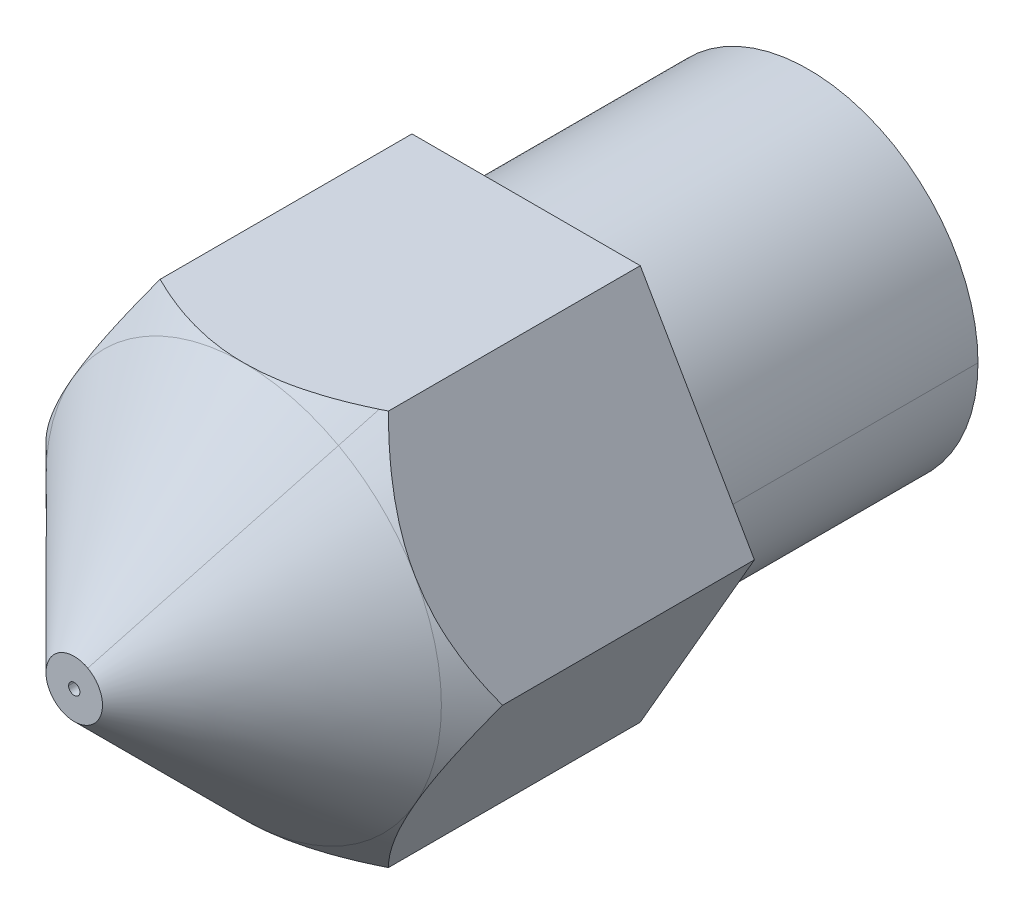
ISO-10303-21;
HEADER;
FILE_DESCRIPTION(('STEP AP214'),'2;1');
FILE_NAME('part.step','',(''),(''),'','','');
FILE_SCHEMA(('AUTOMOTIVE_DESIGN { 1 0 10303 214 1 1 1 1 }'));
ENDSEC;
DATA;
#1=APPLICATION_CONTEXT('core data for automotive mechanical design processes');
#2=APPLICATION_PROTOCOL_DEFINITION('international standard','automotive_design',2000,#1);
#3=PRODUCT_CONTEXT('',#1,'mechanical');
#4=PRODUCT('Part','Part','',(#3));
#5=PRODUCT_RELATED_PRODUCT_CATEGORY('part','',(#4));
#6=PRODUCT_DEFINITION_FORMATION('','',#4);
#7=PRODUCT_DEFINITION_CONTEXT('part definition',#1,'design');
#8=PRODUCT_DEFINITION('design','',#6,#7);
#9=PRODUCT_DEFINITION_SHAPE('','',#8);
#10=(LENGTH_UNIT() NAMED_UNIT(*) SI_UNIT(.MILLI.,.METRE.));
#11=(NAMED_UNIT(*) PLANE_ANGLE_UNIT() SI_UNIT($,.RADIAN.));
#12=(NAMED_UNIT(*) SI_UNIT($,.STERADIAN.) SOLID_ANGLE_UNIT());
#13=UNCERTAINTY_MEASURE_WITH_UNIT(LENGTH_MEASURE(1.E-05),#10,'distance_accuracy_value','');
#14=(GEOMETRIC_REPRESENTATION_CONTEXT(3) GLOBAL_UNCERTAINTY_ASSIGNED_CONTEXT((#13)) GLOBAL_UNIT_ASSIGNED_CONTEXT((#10,
#11,#12)) REPRESENTATION_CONTEXT('',''));
#15=CARTESIAN_POINT('',(0.,0.,0.));
#16=DIRECTION('',(0.,0.,1.));
#17=DIRECTION('',(1.,0.,0.));
#18=AXIS2_PLACEMENT_3D('',#15,#16,#17);
#19=CARTESIAN_POINT('',(0.,0.,-2.5));
#20=DIRECTION('',(0.,0.,-1.));
#21=DIRECTION('',(1.,0.,0.));
#22=AXIS2_PLACEMENT_3D('',#19,#20,#21);
#23=CYLINDRICAL_SURFACE('',#22,2.1);
#24=DIRECTION('',(0.,0.,1.));
#25=VECTOR('',#24,1.);
#26=CARTESIAN_POINT('',(-2.1,0.,-2.5));
#27=LINE('',#26,#25);
#28=CARTESIAN_POINT('',(-2.1,0.,-5.));
#29=VERTEX_POINT('',#28);
#30=CARTESIAN_POINT('',(-2.1,0.,0.));
#31=VERTEX_POINT('',#30);
#32=EDGE_CURVE('E11',#29,#31,#27,.T.);
#33=ORIENTED_EDGE('',*,*,#32,.F.);
#34=CARTESIAN_POINT('',(0.,0.,-5.));
#35=DIRECTION('',(0.,0.,-1.));
#36=DIRECTION('',(1.,0.,0.));
#37=AXIS2_PLACEMENT_3D('',#34,#35,#36);
#38=CIRCLE('',#37,2.1);
#39=CARTESIAN_POINT('',(2.1,0.,-5.));
#40=VERTEX_POINT('',#39);
#41=EDGE_CURVE('E299',#29,#40,#38,.T.);
#42=ORIENTED_EDGE('',*,*,#41,.T.);
#43=DIRECTION('',(0.,0.,1.));
#44=VECTOR('',#43,1.);
#45=CARTESIAN_POINT('',(2.1,0.,-2.5));
#46=LINE('',#45,#44);
#47=CARTESIAN_POINT('',(2.1,0.,0.));
#48=VERTEX_POINT('',#47);
#49=EDGE_CURVE('E29',#40,#48,#46,.T.);
#50=ORIENTED_EDGE('',*,*,#49,.T.);
#51=CARTESIAN_POINT('',(0.,0.,0.));
#52=DIRECTION('',(0.,0.,1.));
#53=DIRECTION('',(1.,0.,0.));
#54=AXIS2_PLACEMENT_3D('',#51,#52,#53);
#55=CIRCLE('',#54,2.1);
#56=EDGE_CURVE('E235',#48,#31,#55,.T.);
#57=ORIENTED_EDGE('',*,*,#56,.T.);
#58=EDGE_LOOP('',(#33,#42,#50,#57));
#59=FACE_BOUND('',#58,.T.);
#60=ADVANCED_FACE('F16',(#59),#23,.F.);
#61=CARTESIAN_POINT('',(0.,0.,-2.5));
#62=DIRECTION('',(0.,0.,-1.));
#63=DIRECTION('',(1.,0.,0.));
#64=AXIS2_PLACEMENT_3D('',#61,#62,#63);
#65=CYLINDRICAL_SURFACE('',#64,2.1);
#66=ORIENTED_EDGE('',*,*,#49,.F.);
#67=CARTESIAN_POINT('',(0.,0.,-5.));
#68=DIRECTION('',(0.,0.,-1.));
#69=DIRECTION('',(1.,0.,0.));
#70=AXIS2_PLACEMENT_3D('',#67,#68,#69);
#71=CIRCLE('',#70,2.1);
#72=EDGE_CURVE('E369',#40,#29,#71,.T.);
#73=ORIENTED_EDGE('',*,*,#72,.T.);
#74=ORIENTED_EDGE('',*,*,#32,.T.);
#75=CARTESIAN_POINT('',(0.,0.,0.));
#76=DIRECTION('',(0.,0.,1.));
#77=DIRECTION('',(1.,0.,0.));
#78=AXIS2_PLACEMENT_3D('',#75,#76,#77);
#79=CIRCLE('',#78,2.1);
#80=EDGE_CURVE('E240',#31,#48,#79,.T.);
#81=ORIENTED_EDGE('',*,*,#80,.T.);
#82=EDGE_LOOP('',(#66,#73,#74,#81));
#83=FACE_BOUND('',#82,.T.);
#84=ADVANCED_FACE('F529',(#83),#65,.F.);
#85=CARTESIAN_POINT('',(0.,0.,-5.));
#86=DIRECTION('',(0.,0.,-1.));
#87=DIRECTION('',(0.,-1.,0.));
#88=AXIS2_PLACEMENT_3D('',#85,#86,#87);
#89=PLANE('',#88);
#90=ORIENTED_EDGE('',*,*,#72,.F.);
#91=ORIENTED_EDGE('',*,*,#41,.F.);
#92=EDGE_LOOP('',(#90,#91));
#93=FACE_BOUND('',#92,.T.);
#94=CARTESIAN_POINT('',(0.,0.,-5.));
#95=DIRECTION('',(0.,0.,-1.));
#96=DIRECTION('',(1.,0.,0.));
#97=AXIS2_PLACEMENT_3D('',#94,#95,#96);
#98=CIRCLE('',#97,3.);
#99=CARTESIAN_POINT('',(3.,0.,-5.));
#100=VERTEX_POINT('',#99);
#101=CARTESIAN_POINT('',(-3.,0.,-5.));
#102=VERTEX_POINT('',#101);
#103=EDGE_CURVE('E357',#100,#102,#98,.T.);
#104=ORIENTED_EDGE('',*,*,#103,.T.);
#105=CARTESIAN_POINT('',(0.,0.,-5.));
#106=DIRECTION('',(0.,0.,-1.));
#107=DIRECTION('',(1.,0.,0.));
#108=AXIS2_PLACEMENT_3D('',#105,#106,#107);
#109=CIRCLE('',#108,3.);
#110=EDGE_CURVE('E420',#102,#100,#109,.T.);
#111=ORIENTED_EDGE('',*,*,#110,.T.);
#112=EDGE_LOOP('',(#104,#111));
#113=FACE_BOUND('',#112,.T.);
#114=ADVANCED_FACE('F597',(#93,#113),#89,.T.);
#115=CARTESIAN_POINT('',(0.,0.,1.1));
#116=DIRECTION('',(0.,0.,-1.));
#117=DIRECTION('',(-0.50000000000019,0.866025403784329,0.));
#118=AXIS2_PLACEMENT_3D('',#115,#116,#117);
#119=CONICAL_SURFACE('',#118,0.999999999999103,0.785398163397);
#120=DIRECTION('',(0.707106781186548,0.,0.707106781186548));
#121=VECTOR('',#120,1.);
#122=CARTESIAN_POINT('',(-1.1,0.,1.));
#123=LINE('',#122,#121);
#124=CARTESIAN_POINT('',(-0.1,0.,2.));
#125=VERTEX_POINT('',#124);
#126=EDGE_CURVE('E241',#31,#125,#123,.T.);
#127=ORIENTED_EDGE('',*,*,#126,.T.);
#128=CARTESIAN_POINT('',(0.,0.,2.));
#129=DIRECTION('',(0.,0.,1.));
#130=DIRECTION('',(1.,0.,0.));
#131=AXIS2_PLACEMENT_3D('',#128,#129,#130);
#132=CIRCLE('',#131,0.1);
#133=CARTESIAN_POINT('',(0.1,0.,2.));
#134=VERTEX_POINT('',#133);
#135=EDGE_CURVE('E308',#125,#134,#132,.T.);
#136=ORIENTED_EDGE('',*,*,#135,.T.);
#137=DIRECTION('',(-0.707106781186548,0.,0.707106781186548));
#138=VECTOR('',#137,1.);
#139=CARTESIAN_POINT('',(1.1,0.,1.));
#140=LINE('',#139,#138);
#141=EDGE_CURVE('E385',#48,#134,#140,.T.);
#142=ORIENTED_EDGE('',*,*,#141,.F.);
#143=ORIENTED_EDGE('',*,*,#80,.F.);
#144=EDGE_LOOP('',(#127,#136,#142,#143));
#145=FACE_BOUND('',#144,.T.);
#146=ADVANCED_FACE('F601',(#145),#119,.F.);
#147=CARTESIAN_POINT('',(0.,0.,1.1));
#148=DIRECTION('',(0.,0.,-1.));
#149=DIRECTION('',(1.,0.,0.));
#150=AXIS2_PLACEMENT_3D('',#147,#148,#149);
#151=CONICAL_SURFACE('',#150,0.999999999999103,0.785398163397);
#152=ORIENTED_EDGE('',*,*,#141,.T.);
#153=CARTESIAN_POINT('',(0.,0.,2.));
#154=DIRECTION('',(0.,0.,1.));
#155=DIRECTION('',(1.,0.,0.));
#156=AXIS2_PLACEMENT_3D('',#153,#154,#155);
#157=CIRCLE('',#156,0.1);
#158=EDGE_CURVE('E342',#134,#125,#157,.T.);
#159=ORIENTED_EDGE('',*,*,#158,.T.);
#160=ORIENTED_EDGE('',*,*,#126,.F.);
#161=ORIENTED_EDGE('',*,*,#56,.F.);
#162=EDGE_LOOP('',(#152,#159,#160,#161));
#163=FACE_BOUND('',#162,.T.);
#164=ADVANCED_FACE('F542',(#163),#151,.F.);
#165=CARTESIAN_POINT('',(0.,0.,1.));
#166=DIRECTION('',(0.,0.,1.));
#167=DIRECTION('',(1.,0.,0.));
#168=AXIS2_PLACEMENT_3D('',#165,#166,#167);
#169=CYLINDRICAL_SURFACE('',#168,0.1);
#170=ORIENTED_EDGE('',*,*,#135,.F.);
#171=DIRECTION('',(0.,0.,-1.));
#172=VECTOR('',#171,1.);
#173=CARTESIAN_POINT('',(-0.1,0.,1.));
#174=LINE('',#173,#172);
#175=CARTESIAN_POINT('',(-0.1,0.,8.));
#176=VERTEX_POINT('',#175);
#177=EDGE_CURVE('E304',#176,#125,#174,.T.);
#178=ORIENTED_EDGE('',*,*,#177,.F.);
#179=CARTESIAN_POINT('',(0.,0.,8.));
#180=DIRECTION('',(0.,0.,1.));
#181=DIRECTION('',(1.,0.,0.));
#182=AXIS2_PLACEMENT_3D('',#179,#180,#181);
#183=CIRCLE('',#182,0.1);
#184=CARTESIAN_POINT('',(0.1,0.,8.));
#185=VERTEX_POINT('',#184);
#186=EDGE_CURVE('E328',#176,#185,#183,.T.);
#187=ORIENTED_EDGE('',*,*,#186,.T.);
#188=DIRECTION('',(0.,0.,-1.));
#189=VECTOR('',#188,1.);
#190=CARTESIAN_POINT('',(0.1,0.,1.));
#191=LINE('',#190,#189);
#192=EDGE_CURVE('E309',#185,#134,#191,.T.);
#193=ORIENTED_EDGE('',*,*,#192,.T.);
#194=EDGE_LOOP('',(#170,#178,#187,#193));
#195=FACE_BOUND('',#194,.T.);
#196=ADVANCED_FACE('F538',(#195),#169,.F.);
#197=CARTESIAN_POINT('',(0.,0.,1.));
#198=DIRECTION('',(0.,0.,1.));
#199=DIRECTION('',(1.,0.,0.));
#200=AXIS2_PLACEMENT_3D('',#197,#198,#199);
#201=CYLINDRICAL_SURFACE('',#200,0.1);
#202=ORIENTED_EDGE('',*,*,#158,.F.);
#203=ORIENTED_EDGE('',*,*,#192,.F.);
#204=CARTESIAN_POINT('',(0.,0.,8.));
#205=DIRECTION('',(0.,0.,1.));
#206=DIRECTION('',(1.,0.,0.));
#207=AXIS2_PLACEMENT_3D('',#204,#205,#206);
#208=CIRCLE('',#207,0.1);
#209=EDGE_CURVE('E324',#185,#176,#208,.T.);
#210=ORIENTED_EDGE('',*,*,#209,.T.);
#211=ORIENTED_EDGE('',*,*,#177,.T.);
#212=EDGE_LOOP('',(#202,#203,#210,#211));
#213=FACE_BOUND('',#212,.T.);
#214=ADVANCED_FACE('F541',(#213),#201,.F.);
#215=CARTESIAN_POINT('',(0.,0.,8.));
#216=DIRECTION('',(0.,0.,1.));
#217=DIRECTION('',(1.,0.,0.));
#218=AXIS2_PLACEMENT_3D('',#215,#216,#217);
#219=PLANE('',#218);
#220=ORIENTED_EDGE('',*,*,#209,.F.);
#221=ORIENTED_EDGE('',*,*,#186,.F.);
#222=EDGE_LOOP('',(#220,#221));
#223=FACE_BOUND('',#222,.T.);
#224=CARTESIAN_POINT('',(0.,0.,8.));
#225=DIRECTION('',(0.,0.,-1.));
#226=DIRECTION('',(-0.479425538604204,-0.877582561890372,0.));
#227=AXIS2_PLACEMENT_3D('',#224,#225,#226);
#228=CIRCLE('',#227,0.5);
#229=CARTESIAN_POINT('',(-0.239712769302,-0.438791280945,8.));
#230=VERTEX_POINT('',#229);
#231=CARTESIAN_POINT('',(0.239712769302,0.438791280945,8.));
#232=VERTEX_POINT('',#231);
#233=EDGE_CURVE('E563',#230,#232,#228,.T.);
#234=ORIENTED_EDGE('',*,*,#233,.F.);
#235=CARTESIAN_POINT('',(0.,0.,8.));
#236=DIRECTION('',(0.,0.,-1.));
#237=DIRECTION('',(0.479425538604206,0.877582561890371,0.));
#238=AXIS2_PLACEMENT_3D('',#235,#236,#237);
#239=CIRCLE('',#238,0.5);
#240=EDGE_CURVE('E453',#232,#230,#239,.T.);
#241=ORIENTED_EDGE('',*,*,#240,.F.);
#242=EDGE_LOOP('',(#234,#241));
#243=FACE_BOUND('',#242,.T.);
#244=ADVANCED_FACE('F514',(#223,#243),#219,.T.);
#245=CARTESIAN_POINT('',(0.,0.,8.));
#246=DIRECTION('',(0.,0.,-1.));
#247=DIRECTION('',(-0.479425538604204,-0.877582561890372,0.));
#248=AXIS2_PLACEMENT_3D('',#245,#246,#247);
#249=CONICAL_SURFACE('',#248,0.5,0.785398163397);
#250=CARTESIAN_POINT('',(0.,0.,5.));
#251=DIRECTION('',(0.,0.,-1.));
#252=DIRECTION('',(1.,0.,0.));
#253=AXIS2_PLACEMENT_3D('',#250,#251,#252);
#254=CIRCLE('',#253,3.5);
#255=CARTESIAN_POINT('',(0.,-3.5,5.));
#256=VERTEX_POINT('',#255);
#257=CARTESIAN_POINT('',(-1.67798938511,-3.07153896662,5.));
#258=VERTEX_POINT('',#257);
#259=EDGE_CURVE('E253',#256,#258,#254,.T.);
#260=ORIENTED_EDGE('',*,*,#259,.T.);
#261=DIRECTION('',(0.339005049420843,0.620544580563713,0.707106781186673));
#262=VECTOR('',#261,1.);
#263=CARTESIAN_POINT('',(-2.52471911871,-4.62146734757,3.23386602212));
#264=LINE('',#263,#262);
#265=CARTESIAN_POINT('',(-1.91205871445,-3.5,4.51177125436));
#266=VERTEX_POINT('',#265);
#267=EDGE_CURVE('E197',#266,#258,#264,.T.);
#268=ORIENTED_EDGE('',*,*,#267,.F.);
#269=CARTESIAN_POINT('',(-2.99967239936E-07,-3.5,4.99999954088));
#270=CARTESIAN_POINT('',(-0.0812121167621,-3.5,4.99999954088));
#271=CARTESIAN_POINT('',(-0.162423958203,-3.5,4.99764419383));
#272=CARTESIAN_POINT('',(-0.243490094198,-3.5,4.99293348996));
#273=CARTESIAN_POINT('',(-0.491200453842,-3.5,4.9714155439));
#274=CARTESIAN_POINT('',(-0.734677478373,-3.5,4.92914020951));
#275=CARTESIAN_POINT('',(-0.895701981959,-3.5,4.89206954358));
#276=CARTESIAN_POINT('',(-1.20392005799,-3.5,4.80557013717));
#277=CARTESIAN_POINT('',(-1.49848234293,-3.5,4.69614124757));
#278=CARTESIAN_POINT('',(-1.63935466622,-3.5,4.63811623536));
#279=CARTESIAN_POINT('',(-1.77710401478,-3.5,4.57647198394));
#280=CARTESIAN_POINT('',(-1.91205871445,-3.5,4.51177125436));
#281=(BOUNDED_CURVE() B_SPLINE_CURVE(5,(#269,#270,#271,#272,#273,#274,#275,#276,#277,#278,#279,
#280),.UNSPECIFIED.,.F.,.F.) B_SPLINE_CURVE_WITH_KNOTS((6,3,3,6),(2.51104797308,2.97899187071,
3.94608377711,4.87207920238),
.UNSPECIFIED.) CURVE() GEOMETRIC_REPRESENTATION_ITEM() RATIONAL_B_SPLINE_CURVE((1.,1.,1.,1.,1.,
1.,1.,1.,1.,1.,1.,1.)) REPRESENTATION_ITEM(''));
#282=EDGE_CURVE('E247',#256,#266,#281,.T.);
#283=ORIENTED_EDGE('',*,*,#282,.F.);
#284=EDGE_LOOP('',(#260,#268,#283));
#285=FACE_BOUND('',#284,.T.);
#286=ADVANCED_FACE('F511',(#285),#249,.T.);
#287=CARTESIAN_POINT('',(0.,0.,8.));
#288=DIRECTION('',(0.,0.,-1.));
#289=DIRECTION('',(-0.479425538604204,-0.877582561890372,0.));
#290=AXIS2_PLACEMENT_3D('',#287,#288,#289);
#291=CONICAL_SURFACE('',#290,0.5,0.785398163397);
#292=ORIENTED_EDGE('',*,*,#267,.T.);
#293=CARTESIAN_POINT('',(0.,0.,5.));
#294=DIRECTION('',(0.,0.,-1.));
#295=DIRECTION('',(1.,0.,0.));
#296=AXIS2_PLACEMENT_3D('',#293,#294,#295);
#297=CIRCLE('',#296,3.5);
#298=CARTESIAN_POINT('',(-3.03108891325,-1.75,5.));
#299=VERTEX_POINT('',#298);
#300=EDGE_CURVE('E191',#258,#299,#297,.T.);
#301=ORIENTED_EDGE('',*,*,#300,.T.);
#302=CARTESIAN_POINT('',(-2.02072594216,-3.5,4.45854811567));
#303=CARTESIAN_POINT('',(-2.09810511936,-3.36597533365,4.53592729287));
#304=CARTESIAN_POINT('',(-2.17728734773,-3.22882769106,4.6095537064));
#305=CARTESIAN_POINT('',(-2.2585486808,-3.08807893349,4.67865414033));
#306=CARTESIAN_POINT('',(-2.41691717901,-2.81377664827,4.79871612158));
#307=CARTESIAN_POINT('',(-2.58323830721,-2.52570000386,4.89206956696));
#308=CARTESIAN_POINT('',(-2.6637494928,-2.38625053983,4.92913987874));
#309=CARTESIAN_POINT('',(-2.78548863582,-2.17539215886,4.97141561315));
#310=CARTESIAN_POINT('',(-2.90934398522,-1.96086840091,4.99293347988));
#311=CARTESIAN_POINT('',(-2.94987708856,-1.89066300653,4.99764418396));
#312=CARTESIAN_POINT('',(-2.99048306973,-1.82033138405,4.99999954088));
#313=CARTESIAN_POINT('',(-3.03108906323,-1.74999974022,4.99999954088));
#314=(BOUNDED_CURVE() B_SPLINE_CURVE(5,(#302,#303,#304,#305,#306,#307,#308,#309,#310,#311,#312,
#313),.UNSPECIFIED.,.F.,.F.) B_SPLINE_CURVE_WITH_KNOTS((6,3,3,6),(0.,1.07600843705,
2.04310309478,2.51104797307),
.UNSPECIFIED.) CURVE() GEOMETRIC_REPRESENTATION_ITEM() RATIONAL_B_SPLINE_CURVE((1.,1.,1.,1.,1.,
1.,1.,1.,1.,1.,1.,1.)) REPRESENTATION_ITEM(''));
#315=CARTESIAN_POINT('',(-2.02072594216,-3.5,4.45854811567));
#316=VERTEX_POINT('',#315);
#317=EDGE_CURVE('E195',#316,#299,#314,.T.);
#318=ORIENTED_EDGE('',*,*,#317,.F.);
#319=CARTESIAN_POINT('',(-1.91205871445,-3.5,4.51177125436));
#320=CARTESIAN_POINT('',(-1.93393638314,-3.5,4.50128254127));
#321=CARTESIAN_POINT('',(-1.95574060818,-3.5,4.49071350696));
#322=CARTESIAN_POINT('',(-1.97747499525,-3.5,4.48006545566));
#323=CARTESIAN_POINT('',(-1.9991355617,-3.5,4.4693433059));
#324=CARTESIAN_POINT('',(-2.02072594216,-3.5,4.45854811567));
#325=(BOUNDED_CURVE() B_SPLINE_CURVE(5,(#319,#320,#321,#322,#323,#324),.UNSPECIFIED.,.F.,
.F.) B_SPLINE_CURVE_WITH_KNOTS((6,6),(0.,0.150114232149),
.UNSPECIFIED.) CURVE() GEOMETRIC_REPRESENTATION_ITEM() RATIONAL_B_SPLINE_CURVE((1.,1.,1.,1.,1.,1.)) REPRESENTATION_ITEM(''));
#326=EDGE_CURVE('E208',#266,#316,#325,.T.);
#327=ORIENTED_EDGE('',*,*,#326,.F.);
#328=EDGE_LOOP('',(#292,#301,#318,#327));
#329=FACE_BOUND('',#328,.T.);
#330=ADVANCED_FACE('F192',(#329),#291,.T.);
#331=CARTESIAN_POINT('',(0.,0.,8.));
#332=DIRECTION('',(0.,0.,-1.));
#333=DIRECTION('',(-0.479425538604204,-0.877582561890372,0.));
#334=AXIS2_PLACEMENT_3D('',#331,#332,#333);
#335=CONICAL_SURFACE('',#334,0.5,0.785398163397);
#336=CARTESIAN_POINT('',(0.,0.,5.));
#337=DIRECTION('',(0.,0.,-1.));
#338=DIRECTION('',(1.,0.,0.));
#339=AXIS2_PLACEMENT_3D('',#336,#337,#338);
#340=CIRCLE('',#339,3.5);
#341=CARTESIAN_POINT('',(3.03108891325,-1.75,5.));
#342=VERTEX_POINT('',#341);
#343=EDGE_CURVE('E259',#342,#256,#340,.T.);
#344=ORIENTED_EDGE('',*,*,#343,.T.);
#345=CARTESIAN_POINT('',(2.02072594216,-3.5,4.45854811567));
#346=CARTESIAN_POINT('',(1.86596758778,-3.5,4.53592729287));
#347=CARTESIAN_POINT('',(1.70760313103,-3.5,4.60955370639));
#348=CARTESIAN_POINT('',(1.54508046489,-3.5,4.67865414033));
#349=CARTESIAN_POINT('',(1.22834346847,-3.5,4.79871612158));
#350=CARTESIAN_POINT('',(0.895701212072,-3.5,4.89206956696));
#351=CARTESIAN_POINT('',(0.734678840883,-3.5,4.92913987874));
#352=CARTESIAN_POINT('',(0.491200554853,-3.5,4.97141561315));
#353=CARTESIAN_POINT('',(0.243489856057,-3.5,4.99293347988));
#354=CARTESIAN_POINT('',(0.162423649366,-3.5,4.99764418396));
#355=CARTESIAN_POINT('',(0.0812116870222,-3.5,4.99999954088));
#356=CARTESIAN_POINT('',(-2.99967239936E-07,-3.5,4.99999954088));
#357=(BOUNDED_CURVE() B_SPLINE_CURVE(5,(#345,#346,#347,#348,#349,#350,#351,#352,#353,#354,#355,
#356),.UNSPECIFIED.,.F.,.F.) B_SPLINE_CURVE_WITH_KNOTS((6,3,3,6),(0.,1.07600843705,
2.04310309478,2.51104797308),
.UNSPECIFIED.) CURVE() GEOMETRIC_REPRESENTATION_ITEM() RATIONAL_B_SPLINE_CURVE((1.,1.,1.,1.,1.,
1.,1.,1.,1.,1.,1.,1.)) REPRESENTATION_ITEM(''));
#358=CARTESIAN_POINT('',(2.02072594216,-3.5,4.45854811567));
#359=VERTEX_POINT('',#358);
#360=EDGE_CURVE('E217',#359,#256,#357,.T.);
#361=ORIENTED_EDGE('',*,*,#360,.F.);
#362=CARTESIAN_POINT('',(3.03108876326,-1.75000025978,4.99999954088));
#363=CARTESIAN_POINT('',(2.99048285486,-1.82033175621,4.99999954088));
#364=CARTESIAN_POINT('',(2.94987693414,-1.89066327399,4.99764419383));
#365=CARTESIAN_POINT('',(2.90934386615,-1.96086860715,4.99293348996));
#366=CARTESIAN_POINT('',(2.78548868632,-2.17539207138,4.9714155439));
#367=CARTESIAN_POINT('',(2.66375017406,-2.38624935986,4.92914020951));
#368=CARTESIAN_POINT('',(2.58323792227,-2.52570067059,4.89206954358));
#369=CARTESIAN_POINT('',(2.41691714671,-2.81377670422,4.7987158471));
#370=CARTESIAN_POINT('',(2.25854923692,-3.08807797026,4.6786547851));
#371=CARTESIAN_POINT('',(2.17728689381,-3.22882847726,4.60955328433));
#372=CARTESIAN_POINT('',(2.09810489757,-3.3659757178,4.53592707108));
#373=CARTESIAN_POINT('',(2.02072594216,-3.5,4.45854811567));
#374=(BOUNDED_CURVE() B_SPLINE_CURVE(5,(#362,#363,#364,#365,#366,#367,#368,#369,#370,#371,#372,
#373),.UNSPECIFIED.,.F.,.F.) B_SPLINE_CURVE_WITH_KNOTS((6,3,3,6),(2.51104797306,2.97899187069,
3.94608377711,5.02208913003),
.UNSPECIFIED.) CURVE() GEOMETRIC_REPRESENTATION_ITEM() RATIONAL_B_SPLINE_CURVE((1.,1.,1.,1.,1.,
1.,1.,1.,1.,1.,1.,1.)) REPRESENTATION_ITEM(''));
#375=EDGE_CURVE('E285',#342,#359,#374,.T.);
#376=ORIENTED_EDGE('',*,*,#375,.F.);
#377=EDGE_LOOP('',(#344,#361,#376));
#378=FACE_BOUND('',#377,.T.);
#379=ADVANCED_FACE('F494',(#378),#335,.T.);
#380=CARTESIAN_POINT('',(0.,0.,8.));
#381=DIRECTION('',(0.,0.,-1.));
#382=DIRECTION('',(-0.479425538604204,-0.877582561890372,0.));
#383=AXIS2_PLACEMENT_3D('',#380,#381,#382);
#384=CONICAL_SURFACE('',#383,0.5,0.785398163397);
#385=ORIENTED_EDGE('',*,*,#259,.F.);
#386=ORIENTED_EDGE('',*,*,#343,.F.);
#387=CARTESIAN_POINT('',(0.,0.,5.));
#388=DIRECTION('',(0.,0.,-1.));
#389=DIRECTION('',(1.,0.,0.));
#390=AXIS2_PLACEMENT_3D('',#387,#388,#389);
#391=CIRCLE('',#390,3.5);
#392=CARTESIAN_POINT('',(3.03108891325,1.75,5.));
#393=VERTEX_POINT('',#392);
#394=EDGE_CURVE('E228',#393,#342,#391,.T.);
#395=ORIENTED_EDGE('',*,*,#394,.F.);
#396=CARTESIAN_POINT('',(0.,0.,5.));
#397=DIRECTION('',(0.,0.,-1.));
#398=DIRECTION('',(1.,0.,0.));
#399=AXIS2_PLACEMENT_3D('',#396,#397,#398);
#400=CIRCLE('',#399,3.5);
#401=CARTESIAN_POINT('',(1.67798938511,3.07153896662,5.));
#402=VERTEX_POINT('',#401);
#403=EDGE_CURVE('E345',#402,#393,#400,.T.);
#404=ORIENTED_EDGE('',*,*,#403,.F.);
#405=DIRECTION('',(-0.339005049420843,-0.620544580563713,0.707106781186673));
#406=VECTOR('',#405,1.);
#407=CARTESIAN_POINT('',(2.52471911871,4.62146734757,3.23386602212));
#408=LINE('',#407,#406);
#409=EDGE_CURVE('E144',#402,#232,#408,.T.);
#410=ORIENTED_EDGE('',*,*,#409,.T.);
#411=ORIENTED_EDGE('',*,*,#240,.T.);
#412=DIRECTION('',(0.339005049420843,0.620544580563713,0.707106781186673));
#413=VECTOR('',#412,1.);
#414=CARTESIAN_POINT('',(-2.52471911871,-4.62146734757,3.23386602212));
#415=LINE('',#414,#413);
#416=EDGE_CURVE('E201',#258,#230,#415,.T.);
#417=ORIENTED_EDGE('',*,*,#416,.F.);
#418=EDGE_LOOP('',(#385,#386,#395,#404,#410,#411,#417));
#419=FACE_BOUND('',#418,.T.);
#420=ADVANCED_FACE('F484',(#419),#384,.T.);
#421=CARTESIAN_POINT('',(0.,0.,8.));
#422=DIRECTION('',(0.,0.,-1.));
#423=DIRECTION('',(-0.479425538604204,-0.877582561890372,0.));
#424=AXIS2_PLACEMENT_3D('',#421,#422,#423);
#425=CONICAL_SURFACE('',#424,0.5,0.785398163397);
#426=CARTESIAN_POINT('',(0.,0.,5.));
#427=DIRECTION('',(0.,0.,-1.));
#428=DIRECTION('',(1.,0.,0.));
#429=AXIS2_PLACEMENT_3D('',#426,#427,#428);
#430=CIRCLE('',#429,3.5);
#431=CARTESIAN_POINT('',(0.,3.5,5.));
#432=VERTEX_POINT('',#431);
#433=EDGE_CURVE('E260',#432,#402,#430,.T.);
#434=ORIENTED_EDGE('',*,*,#433,.F.);
#435=CARTESIAN_POINT('',(0.,0.,5.));
#436=DIRECTION('',(0.,0.,-1.));
#437=DIRECTION('',(1.,0.,0.));
#438=AXIS2_PLACEMENT_3D('',#435,#436,#437);
#439=CIRCLE('',#438,3.5);
#440=CARTESIAN_POINT('',(-3.03108891325,1.75,5.));
#441=VERTEX_POINT('',#440);
#442=EDGE_CURVE('E205',#441,#432,#439,.T.);
#443=ORIENTED_EDGE('',*,*,#442,.F.);
#444=CARTESIAN_POINT('',(0.,0.,5.));
#445=DIRECTION('',(0.,0.,-1.));
#446=DIRECTION('',(1.,0.,0.));
#447=AXIS2_PLACEMENT_3D('',#444,#445,#446);
#448=CIRCLE('',#447,3.5);
#449=EDGE_CURVE('E131',#299,#441,#448,.T.);
#450=ORIENTED_EDGE('',*,*,#449,.F.);
#451=ORIENTED_EDGE('',*,*,#300,.F.);
#452=ORIENTED_EDGE('',*,*,#416,.T.);
#453=ORIENTED_EDGE('',*,*,#233,.T.);
#454=ORIENTED_EDGE('',*,*,#409,.F.);
#455=EDGE_LOOP('',(#434,#443,#450,#451,#452,#453,#454));
#456=FACE_BOUND('',#455,.T.);
#457=ADVANCED_FACE('F203',(#456),#425,.T.);
#458=CARTESIAN_POINT('',(0.,0.,8.));
#459=DIRECTION('',(0.,0.,-1.));
#460=DIRECTION('',(-0.479425538604204,-0.877582561890372,0.));
#461=AXIS2_PLACEMENT_3D('',#458,#459,#460);
#462=CONICAL_SURFACE('',#461,0.5,0.785398163397);
#463=ORIENTED_EDGE('',*,*,#449,.T.);
#464=CARTESIAN_POINT('',(-4.04145188433,0.,4.45854811567));
#465=CARTESIAN_POINT('',(-3.96407270713,0.134024666348,4.53592729287));
#466=CARTESIAN_POINT('',(-3.88489047876,0.271172308943,4.6095537064));
#467=CARTESIAN_POINT('',(-3.80362914569,0.411921066511,4.67865414033));
#468=CARTESIAN_POINT('',(-3.64526064748,0.686223351728,4.79871612158));
#469=CARTESIAN_POINT('',(-3.47893951928,0.974299996145,4.89206956696));
#470=CARTESIAN_POINT('',(-3.39842833369,1.11374946017,4.92913987874));
#471=CARTESIAN_POINT('',(-3.27668919067,1.32460784114,4.97141561315));
#472=CARTESIAN_POINT('',(-3.15283384128,1.53913159909,4.99293347988));
#473=CARTESIAN_POINT('',(-3.11230073793,1.60933699347,4.99764418396));
#474=CARTESIAN_POINT('',(-3.07169475676,1.67966861595,4.99999954088));
#475=CARTESIAN_POINT('',(-3.03108876326,1.75000025978,4.99999954088));
#476=(BOUNDED_CURVE() B_SPLINE_CURVE(5,(#464,#465,#466,#467,#468,#469,#470,#471,#472,#473,#474,
#475),.UNSPECIFIED.,.F.,.F.) B_SPLINE_CURVE_WITH_KNOTS((6,3,3,6),(0.,1.07600843705,
2.04310309478,2.51104797307),
.UNSPECIFIED.) CURVE() GEOMETRIC_REPRESENTATION_ITEM() RATIONAL_B_SPLINE_CURVE((1.,1.,1.,1.,1.,
1.,1.,1.,1.,1.,1.,1.)) REPRESENTATION_ITEM(''));
#477=CARTESIAN_POINT('',(-4.04145188433,0.,4.45854811567));
#478=VERTEX_POINT('',#477);
#479=EDGE_CURVE('E213',#478,#441,#476,.T.);
#480=ORIENTED_EDGE('',*,*,#479,.F.);
#481=CARTESIAN_POINT('',(-3.03108906323,-1.74999974022,4.99999954088));
#482=CARTESIAN_POINT('',(-3.07169497163,-1.67966824379,4.99999954088));
#483=CARTESIAN_POINT('',(-3.11230089235,-1.60933672601,4.99764419383));
#484=CARTESIAN_POINT('',(-3.15283396035,-1.53913139285,4.99293348996));
#485=CARTESIAN_POINT('',(-3.27668914017,-1.32460792862,4.9714155439));
#486=CARTESIAN_POINT('',(-3.39842765243,-1.11375064014,4.92914020951));
#487=CARTESIAN_POINT('',(-3.47893990423,-0.974299329402,4.89206954358));
#488=CARTESIAN_POINT('',(-3.64526067978,-0.68622329578,4.7987158471));
#489=CARTESIAN_POINT('',(-3.80362858957,-0.411922029742,4.6786547851));
#490=CARTESIAN_POINT('',(-3.88489093268,-0.27117152274,4.60955328433));
#491=CARTESIAN_POINT('',(-3.96407292892,-0.134024282197,4.53592707108));
#492=CARTESIAN_POINT('',(-4.04145188433,0.,4.45854811567));
#493=(BOUNDED_CURVE() B_SPLINE_CURVE(5,(#481,#482,#483,#484,#485,#486,#487,#488,#489,#490,#491,
#492),.UNSPECIFIED.,.F.,.F.) B_SPLINE_CURVE_WITH_KNOTS((6,3,3,6),(2.51104797307,2.97899187069,
3.94608377708,5.02208913001),
.UNSPECIFIED.) CURVE() GEOMETRIC_REPRESENTATION_ITEM() RATIONAL_B_SPLINE_CURVE((1.,1.,1.,1.,1.,
1.,1.,1.,1.,1.,1.,1.)) REPRESENTATION_ITEM(''));
#494=EDGE_CURVE('E210',#299,#478,#493,.T.);
#495=ORIENTED_EDGE('',*,*,#494,.F.);
#496=EDGE_LOOP('',(#463,#480,#495));
#497=FACE_BOUND('',#496,.T.);
#498=ADVANCED_FACE('F211',(#497),#462,.T.);
#499=CARTESIAN_POINT('',(-2.02072594216,-3.5,0.));
#500=DIRECTION('',(0.,-1.,0.));
#501=DIRECTION('',(0.,0.,-1.));
#502=AXIS2_PLACEMENT_3D('',#499,#500,#501);
#503=PLANE('',#502);
#504=DIRECTION('',(0.,0.,1.));
#505=VECTOR('',#504,1.);
#506=CARTESIAN_POINT('',(-2.02072594216,-3.5,2.22927405784));
#507=LINE('',#506,#505);
#508=CARTESIAN_POINT('',(-2.02072594216,-3.5,0.));
#509=VERTEX_POINT('',#508);
#510=EDGE_CURVE('E221',#509,#316,#507,.T.);
#511=ORIENTED_EDGE('',*,*,#510,.F.);
#512=DIRECTION('',(1.,0.,0.));
#513=VECTOR('',#512,1.);
#514=CARTESIAN_POINT('',(0.,-3.5,0.));
#515=LINE('',#514,#513);
#516=CARTESIAN_POINT('',(2.02072594216,-3.5,0.));
#517=VERTEX_POINT('',#516);
#518=EDGE_CURVE('E234',#509,#517,#515,.T.);
#519=ORIENTED_EDGE('',*,*,#518,.T.);
#520=DIRECTION('',(0.,0.,1.));
#521=VECTOR('',#520,1.);
#522=CARTESIAN_POINT('',(2.02072594216,-3.5,2.22927405784));
#523=LINE('',#522,#521);
#524=EDGE_CURVE('E286',#517,#359,#523,.T.);
#525=ORIENTED_EDGE('',*,*,#524,.T.);
#526=ORIENTED_EDGE('',*,*,#360,.T.);
#527=ORIENTED_EDGE('',*,*,#282,.T.);
#528=ORIENTED_EDGE('',*,*,#326,.T.);
#529=EDGE_LOOP('',(#511,#519,#525,#526,#527,#528));
#530=FACE_BOUND('',#529,.T.);
#531=ADVANCED_FACE('F523',(#530),#503,.T.);
#532=CARTESIAN_POINT('',(-4.04145188433,0.,0.));
#533=DIRECTION('',(-0.866025403784329,-0.50000000000019,0.));
#534=DIRECTION('',(-0.50000000000019,0.866025403784329,0.));
#535=AXIS2_PLACEMENT_3D('',#532,#533,#534);
#536=PLANE('',#535);
#537=DIRECTION('',(0.,0.,1.));
#538=VECTOR('',#537,1.);
#539=CARTESIAN_POINT('',(-4.04145188433,0.,2.22927405784));
#540=LINE('',#539,#538);
#541=CARTESIAN_POINT('',(-4.04145188433,0.,0.));
#542=VERTEX_POINT('',#541);
#543=EDGE_CURVE('E301',#542,#478,#540,.T.);
#544=ORIENTED_EDGE('',*,*,#543,.F.);
#545=DIRECTION('',(0.50000000000019,-0.866025403784329,0.));
#546=VECTOR('',#545,1.);
#547=CARTESIAN_POINT('',(-3.03108891325,-1.75,0.));
#548=LINE('',#547,#546);
#549=EDGE_CURVE('E265',#542,#509,#548,.T.);
#550=ORIENTED_EDGE('',*,*,#549,.T.);
#551=ORIENTED_EDGE('',*,*,#510,.T.);
#552=ORIENTED_EDGE('',*,*,#317,.T.);
#553=ORIENTED_EDGE('',*,*,#494,.T.);
#554=EDGE_LOOP('',(#544,#550,#551,#552,#553));
#555=FACE_BOUND('',#554,.T.);
#556=ADVANCED_FACE('F219',(#555),#536,.T.);
#557=CARTESIAN_POINT('',(0.,0.,8.));
#558=DIRECTION('',(0.,0.,-1.));
#559=DIRECTION('',(-0.479425538604204,-0.877582561890372,0.));
#560=AXIS2_PLACEMENT_3D('',#557,#558,#559);
#561=CONICAL_SURFACE('',#560,0.5,0.785398163397);
#562=ORIENTED_EDGE('',*,*,#394,.T.);
#563=CARTESIAN_POINT('',(4.04145188433,0.,4.45854811567));
#564=CARTESIAN_POINT('',(3.96407270713,-0.134024666348,4.53592729287));
#565=CARTESIAN_POINT('',(3.88489047876,-0.271172308944,4.6095537064));
#566=CARTESIAN_POINT('',(3.80362914569,-0.411921066511,4.67865414033));
#567=CARTESIAN_POINT('',(3.64526064748,-0.686223351726,4.79871612158));
#568=CARTESIAN_POINT('',(3.47893951928,-0.974299996141,4.89206956696));
#569=CARTESIAN_POINT('',(3.39842833368,-1.11374946018,4.92913987874));
#570=CARTESIAN_POINT('',(3.27668919067,-1.32460784115,4.97141561315));
#571=CARTESIAN_POINT('',(3.15283384127,-1.53913159909,4.99293347988));
#572=CARTESIAN_POINT('',(3.11230073793,-1.60933699347,4.99764418396));
#573=CARTESIAN_POINT('',(3.07169475676,-1.67966861595,4.99999954088));
#574=CARTESIAN_POINT('',(3.03108876326,-1.75000025978,4.99999954088));
#575=(BOUNDED_CURVE() B_SPLINE_CURVE(5,(#563,#564,#565,#566,#567,#568,#569,#570,#571,#572,#573,
#574),.UNSPECIFIED.,.F.,.F.) B_SPLINE_CURVE_WITH_KNOTS((6,3,3,6),(0.,1.07600843706,
2.04310309477,2.51104797306),
.UNSPECIFIED.) CURVE() GEOMETRIC_REPRESENTATION_ITEM() RATIONAL_B_SPLINE_CURVE((1.,1.,1.,1.,1.,
1.,1.,1.,1.,1.,1.,1.)) REPRESENTATION_ITEM(''));
#576=CARTESIAN_POINT('',(4.04145188433,0.,4.45854811567));
#577=VERTEX_POINT('',#576);
#578=EDGE_CURVE('E276',#577,#342,#575,.T.);
#579=ORIENTED_EDGE('',*,*,#578,.F.);
#580=CARTESIAN_POINT('',(3.03108906323,1.74999974022,4.99999954088));
#581=CARTESIAN_POINT('',(3.07169497163,1.67966824379,4.99999954088));
#582=CARTESIAN_POINT('',(3.11230089235,1.60933672601,4.99764419383));
#583=CARTESIAN_POINT('',(3.15283396035,1.53913139285,4.99293348996));
#584=CARTESIAN_POINT('',(3.27668914017,1.32460792862,4.9714155439));
#585=CARTESIAN_POINT('',(3.39842765243,1.11375064014,4.92914020951));
#586=CARTESIAN_POINT('',(3.47893990423,0.974299329403,4.89206954358));
#587=CARTESIAN_POINT('',(3.64526067978,0.686223295781,4.7987158471));
#588=CARTESIAN_POINT('',(3.80362858957,0.411922029743,4.6786547851));
#589=CARTESIAN_POINT('',(3.88489093268,0.271171522739,4.60955328433));
#590=CARTESIAN_POINT('',(3.96407292892,0.134024282197,4.53592707108));
#591=CARTESIAN_POINT('',(4.04145188433,0.,4.45854811567));
#592=(BOUNDED_CURVE() B_SPLINE_CURVE(5,(#580,#581,#582,#583,#584,#585,#586,#587,#588,#589,#590,
#591),.UNSPECIFIED.,.F.,.F.) B_SPLINE_CURVE_WITH_KNOTS((6,3,3,6),(2.51104797307,2.9789918707,
3.9460837771,5.02208913003),
.UNSPECIFIED.) CURVE() GEOMETRIC_REPRESENTATION_ITEM() RATIONAL_B_SPLINE_CURVE((1.,1.,1.,1.,1.,
1.,1.,1.,1.,1.,1.,1.)) REPRESENTATION_ITEM(''));
#593=EDGE_CURVE('E269',#393,#577,#592,.T.);
#594=ORIENTED_EDGE('',*,*,#593,.F.);
#595=EDGE_LOOP('',(#562,#579,#594));
#596=FACE_BOUND('',#595,.T.);
#597=ADVANCED_FACE('F495',(#596),#561,.T.);
#598=CARTESIAN_POINT('',(2.02072594216,-3.5,0.));
#599=DIRECTION('',(0.866025403784329,-0.50000000000019,0.));
#600=DIRECTION('',(0.,0.,-1.));
#601=AXIS2_PLACEMENT_3D('',#598,#599,#600);
#602=PLANE('',#601);
#603=ORIENTED_EDGE('',*,*,#524,.F.);
#604=DIRECTION('',(0.50000000000019,0.866025403784329,0.));
#605=VECTOR('',#604,1.);
#606=CARTESIAN_POINT('',(3.03108891325,-1.75,0.));
#607=LINE('',#606,#605);
#608=CARTESIAN_POINT('',(4.04145188433,0.,0.));
#609=VERTEX_POINT('',#608);
#610=EDGE_CURVE('E275',#517,#609,#607,.T.);
#611=ORIENTED_EDGE('',*,*,#610,.T.);
#612=DIRECTION('',(0.,0.,1.));
#613=VECTOR('',#612,1.);
#614=CARTESIAN_POINT('',(4.04145188433,0.,2.22927405784));
#615=LINE('',#614,#613);
#616=EDGE_CURVE('E246',#609,#577,#615,.T.);
#617=ORIENTED_EDGE('',*,*,#616,.T.);
#618=ORIENTED_EDGE('',*,*,#578,.T.);
#619=ORIENTED_EDGE('',*,*,#375,.T.);
#620=EDGE_LOOP('',(#603,#611,#617,#618,#619));
#621=FACE_BOUND('',#620,.T.);
#622=ADVANCED_FACE('F530',(#621),#602,.T.);
#623=CARTESIAN_POINT('',(0.,0.,8.));
#624=DIRECTION('',(0.,0.,-1.));
#625=DIRECTION('',(-0.479425538604204,-0.877582561890372,0.));
#626=AXIS2_PLACEMENT_3D('',#623,#624,#625);
#627=CONICAL_SURFACE('',#626,0.5,0.785398163397);
#628=DIRECTION('',(-0.339005049420843,-0.620544580563713,0.707106781186673));
#629=VECTOR('',#628,1.);
#630=CARTESIAN_POINT('',(2.52471911871,4.62146734757,3.23386602212));
#631=LINE('',#630,#629);
#632=CARTESIAN_POINT('',(1.91205871445,3.5,4.51177125436));
#633=VERTEX_POINT('',#632);
#634=EDGE_CURVE('E264',#633,#402,#631,.T.);
#635=ORIENTED_EDGE('',*,*,#634,.T.);
#636=ORIENTED_EDGE('',*,*,#403,.T.);
#637=CARTESIAN_POINT('',(2.02072594216,3.5,4.45854811567));
#638=CARTESIAN_POINT('',(2.09810511936,3.36597533365,4.53592729287));
#639=CARTESIAN_POINT('',(2.17728734773,3.22882769106,4.6095537064));
#640=CARTESIAN_POINT('',(2.2585486808,3.08807893349,4.67865414033));
#641=CARTESIAN_POINT('',(2.41691717901,2.81377664827,4.79871612158));
#642=CARTESIAN_POINT('',(2.58323830721,2.52570000386,4.89206956696));
#643=CARTESIAN_POINT('',(2.66374949281,2.38625053983,4.92913987874));
#644=CARTESIAN_POINT('',(2.78548863582,2.17539215886,4.97141561315));
#645=CARTESIAN_POINT('',(2.90934398522,1.96086840091,4.99293347988));
#646=CARTESIAN_POINT('',(2.94987708856,1.89066300653,4.99764418396));
#647=CARTESIAN_POINT('',(2.99048306973,1.82033138405,4.99999954088));
#648=CARTESIAN_POINT('',(3.03108906323,1.74999974022,4.99999954088));
#649=(BOUNDED_CURVE() B_SPLINE_CURVE(5,(#637,#638,#639,#640,#641,#642,#643,#644,#645,#646,#647,
#648),.UNSPECIFIED.,.F.,.F.) B_SPLINE_CURVE_WITH_KNOTS((6,3,3,6),(0.,1.07600843706,
2.04310309478,2.51104797307),
.UNSPECIFIED.) CURVE() GEOMETRIC_REPRESENTATION_ITEM() RATIONAL_B_SPLINE_CURVE((1.,1.,1.,1.,1.,
1.,1.,1.,1.,1.,1.,1.)) REPRESENTATION_ITEM(''));
#650=CARTESIAN_POINT('',(2.02072594216,3.5,4.45854811567));
#651=VERTEX_POINT('',#650);
#652=EDGE_CURVE('E245',#651,#393,#649,.T.);
#653=ORIENTED_EDGE('',*,*,#652,.F.);
#654=CARTESIAN_POINT('',(1.91205871445,3.5,4.51177125436));
#655=CARTESIAN_POINT('',(1.93393638314,3.5,4.50128254127));
#656=CARTESIAN_POINT('',(1.95574060818,3.5,4.49071350696));
#657=CARTESIAN_POINT('',(1.97747499525,3.5,4.48006545566));
#658=CARTESIAN_POINT('',(1.9991355617,3.5,4.4693433059));
#659=CARTESIAN_POINT('',(2.02072594216,3.5,4.45854811567));
#660=(BOUNDED_CURVE() B_SPLINE_CURVE(5,(#654,#655,#656,#657,#658,#659),.UNSPECIFIED.,.F.,
.F.) B_SPLINE_CURVE_WITH_KNOTS((6,6),(0.,0.150114232149),
.UNSPECIFIED.) CURVE() GEOMETRIC_REPRESENTATION_ITEM() RATIONAL_B_SPLINE_CURVE((1.,1.,1.,1.,1.,1.)) REPRESENTATION_ITEM(''));
#661=EDGE_CURVE('E329',#633,#651,#660,.T.);
#662=ORIENTED_EDGE('',*,*,#661,.F.);
#663=EDGE_LOOP('',(#635,#636,#653,#662));
#664=FACE_BOUND('',#663,.T.);
#665=ADVANCED_FACE('F533',(#664),#627,.T.);
#666=CARTESIAN_POINT('',(0.,0.,8.));
#667=DIRECTION('',(0.,0.,-1.));
#668=DIRECTION('',(-0.479425538604204,-0.877582561890372,0.));
#669=AXIS2_PLACEMENT_3D('',#666,#667,#668);
#670=CONICAL_SURFACE('',#669,0.5,0.785398163397);
#671=ORIENTED_EDGE('',*,*,#433,.T.);
#672=ORIENTED_EDGE('',*,*,#634,.F.);
#673=CARTESIAN_POINT('',(2.99967222173E-07,3.5,4.99999954088));
#674=CARTESIAN_POINT('',(0.0812121167626,3.5,4.99999954088));
#675=CARTESIAN_POINT('',(0.162423958204,3.5,4.99764419383));
#676=CARTESIAN_POINT('',(0.243490094199,3.5,4.99293348996));
#677=CARTESIAN_POINT('',(0.491200453841,3.5,4.9714155439));
#678=CARTESIAN_POINT('',(0.734677478371,3.5,4.92914020951));
#679=CARTESIAN_POINT('',(0.895701981962,3.5,4.89206954357));
#680=CARTESIAN_POINT('',(1.20392005799,3.5,4.80557013717));
#681=CARTESIAN_POINT('',(1.49848234292,3.5,4.69614124757));
#682=CARTESIAN_POINT('',(1.63935466622,3.5,4.63811623536));
#683=CARTESIAN_POINT('',(1.77710401478,3.5,4.57647198394));
#684=CARTESIAN_POINT('',(1.91205871445,3.5,4.51177125436));
#685=(BOUNDED_CURVE() B_SPLINE_CURVE(5,(#673,#674,#675,#676,#677,#678,#679,#680,#681,#682,#683,
#684),.UNSPECIFIED.,.F.,.F.) B_SPLINE_CURVE_WITH_KNOTS((6,3,3,6),(2.51104797307,2.9789918707,
3.9460837771,4.87207920236),
.UNSPECIFIED.) CURVE() GEOMETRIC_REPRESENTATION_ITEM() RATIONAL_B_SPLINE_CURVE((1.,1.,1.,1.,1.,
1.,1.,1.,1.,1.,1.,1.)) REPRESENTATION_ITEM(''));
#686=EDGE_CURVE('E335',#432,#633,#685,.T.);
#687=ORIENTED_EDGE('',*,*,#686,.F.);
#688=EDGE_LOOP('',(#671,#672,#687));
#689=FACE_BOUND('',#688,.T.);
#690=ADVANCED_FACE('F18',(#689),#670,.T.);
#691=CARTESIAN_POINT('',(0.,0.,8.));
#692=DIRECTION('',(0.,0.,-1.));
#693=DIRECTION('',(-0.479425538604204,-0.877582561890372,0.));
#694=AXIS2_PLACEMENT_3D('',#691,#692,#693);
#695=CONICAL_SURFACE('',#694,0.5,0.785398163397);
#696=ORIENTED_EDGE('',*,*,#442,.T.);
#697=CARTESIAN_POINT('',(-2.02072594216,3.5,4.45854811567));
#698=CARTESIAN_POINT('',(-1.86596758778,3.5,4.53592729287));
#699=CARTESIAN_POINT('',(-1.70760313103,3.5,4.6095537064));
#700=CARTESIAN_POINT('',(-1.54508046489,3.5,4.67865414033));
#701=CARTESIAN_POINT('',(-1.22834346848,3.5,4.79871612158));
#702=CARTESIAN_POINT('',(-0.895701212075,3.5,4.89206956696));
#703=CARTESIAN_POINT('',(-0.734678840879,3.5,4.92913987874));
#704=CARTESIAN_POINT('',(-0.491200554852,3.5,4.97141561315));
#705=CARTESIAN_POINT('',(-0.243489856058,3.5,4.99293347988));
#706=CARTESIAN_POINT('',(-0.162423649367,3.5,4.99764418396));
#707=CARTESIAN_POINT('',(-0.0812116870227,3.5,4.99999954088));
#708=CARTESIAN_POINT('',(2.99967222173E-07,3.5,4.99999954088));
#709=(BOUNDED_CURVE() B_SPLINE_CURVE(5,(#697,#698,#699,#700,#701,#702,#703,#704,#705,#706,#707,
#708),.UNSPECIFIED.,.F.,.F.) B_SPLINE_CURVE_WITH_KNOTS((6,3,3,6),(0.,1.07600843706,
2.04310309478,2.51104797307),
.UNSPECIFIED.) CURVE() GEOMETRIC_REPRESENTATION_ITEM() RATIONAL_B_SPLINE_CURVE((1.,1.,1.,1.,1.,
1.,1.,1.,1.,1.,1.,1.)) REPRESENTATION_ITEM(''));
#710=CARTESIAN_POINT('',(-2.02072594216,3.5,4.45854811567));
#711=VERTEX_POINT('',#710);
#712=EDGE_CURVE('E322',#711,#432,#709,.T.);
#713=ORIENTED_EDGE('',*,*,#712,.F.);
#714=CARTESIAN_POINT('',(-3.03108876326,1.75000025978,4.99999954088));
#715=CARTESIAN_POINT('',(-2.99048285486,1.82033175621,4.99999954088));
#716=CARTESIAN_POINT('',(-2.94987693414,1.89066327399,4.99764419383));
#717=CARTESIAN_POINT('',(-2.90934386614,1.96086860715,4.99293348996));
#718=CARTESIAN_POINT('',(-2.78548868632,2.17539207138,4.9714155439));
#719=CARTESIAN_POINT('',(-2.66375017406,2.38624935986,4.92914020951));
#720=CARTESIAN_POINT('',(-2.58323792227,2.5257006706,4.89206954358));
#721=CARTESIAN_POINT('',(-2.41691714671,2.81377670422,4.7987158471));
#722=CARTESIAN_POINT('',(-2.25854923692,3.08807797026,4.6786547851));
#723=CARTESIAN_POINT('',(-2.17728689381,3.22882847726,4.60955328433));
#724=CARTESIAN_POINT('',(-2.09810489757,3.3659757178,4.53592707108));
#725=CARTESIAN_POINT('',(-2.02072594216,3.5,4.45854811567));
#726=(BOUNDED_CURVE() B_SPLINE_CURVE(5,(#714,#715,#716,#717,#718,#719,#720,#721,#722,#723,#724,
#725),.UNSPECIFIED.,.F.,.F.) B_SPLINE_CURVE_WITH_KNOTS((6,3,3,6),(2.51104797307,2.97899187069,
3.9460837771,5.02208913002),
.UNSPECIFIED.) CURVE() GEOMETRIC_REPRESENTATION_ITEM() RATIONAL_B_SPLINE_CURVE((1.,1.,1.,1.,1.,
1.,1.,1.,1.,1.,1.,1.)) REPRESENTATION_ITEM(''));
#727=EDGE_CURVE('E363',#441,#711,#726,.T.);
#728=ORIENTED_EDGE('',*,*,#727,.F.);
#729=EDGE_LOOP('',(#696,#713,#728));
#730=FACE_BOUND('',#729,.T.);
#731=ADVANCED_FACE('F501',(#730),#695,.T.);
#732=CARTESIAN_POINT('',(-2.02072594216,3.5,0.));
#733=DIRECTION('',(-0.866025403784329,0.50000000000019,0.));
#734=DIRECTION('',(0.,0.,1.));
#735=AXIS2_PLACEMENT_3D('',#732,#733,#734);
#736=PLANE('',#735);
#737=DIRECTION('',(0.,0.,1.));
#738=VECTOR('',#737,1.);
#739=CARTESIAN_POINT('',(-2.02072594216,3.5,2.22927405784));
#740=LINE('',#739,#738);
#741=CARTESIAN_POINT('',(-2.02072594216,3.5,0.));
#742=VERTEX_POINT('',#741);
#743=EDGE_CURVE('E315',#742,#711,#740,.T.);
#744=ORIENTED_EDGE('',*,*,#743,.F.);
#745=DIRECTION('',(-0.50000000000019,-0.866025403784329,0.));
#746=VECTOR('',#745,1.);
#747=CARTESIAN_POINT('',(-3.03108891325,1.75,0.));
#748=LINE('',#747,#746);
#749=EDGE_CURVE('E268',#742,#542,#748,.T.);
#750=ORIENTED_EDGE('',*,*,#749,.T.);
#751=ORIENTED_EDGE('',*,*,#543,.T.);
#752=ORIENTED_EDGE('',*,*,#479,.T.);
#753=ORIENTED_EDGE('',*,*,#727,.T.);
#754=EDGE_LOOP('',(#744,#750,#751,#752,#753));
#755=FACE_BOUND('',#754,.T.);
#756=ADVANCED_FACE('F497',(#755),#736,.T.);
#757=CARTESIAN_POINT('',(0.,0.,0.));
#758=DIRECTION('',(0.,0.,1.));
#759=DIRECTION('',(1.,0.,0.));
#760=AXIS2_PLACEMENT_3D('',#757,#758,#759);
#761=PLANE('',#760);
#762=CARTESIAN_POINT('',(0.,0.,0.));
#763=DIRECTION('',(0.,0.,-1.));
#764=DIRECTION('',(1.,0.,0.));
#765=AXIS2_PLACEMENT_3D('',#762,#763,#764);
#766=CIRCLE('',#765,3.);
#767=CARTESIAN_POINT('',(-3.,0.,0.));
#768=VERTEX_POINT('',#767);
#769=CARTESIAN_POINT('',(3.,0.,0.));
#770=VERTEX_POINT('',#769);
#771=EDGE_CURVE('E384',#768,#770,#766,.T.);
#772=ORIENTED_EDGE('',*,*,#771,.F.);
#773=CARTESIAN_POINT('',(0.,0.,0.));
#774=DIRECTION('',(0.,0.,-1.));
#775=DIRECTION('',(1.,0.,0.));
#776=AXIS2_PLACEMENT_3D('',#773,#774,#775);
#777=CIRCLE('',#776,3.);
#778=EDGE_CURVE('E358',#770,#768,#777,.T.);
#779=ORIENTED_EDGE('',*,*,#778,.F.);
#780=EDGE_LOOP('',(#772,#779));
#781=FACE_BOUND('',#780,.T.);
#782=DIRECTION('',(-0.50000000000019,0.866025403784329,0.));
#783=VECTOR('',#782,1.);
#784=CARTESIAN_POINT('',(3.03108891325,1.75,0.));
#785=LINE('',#784,#783);
#786=CARTESIAN_POINT('',(2.02072594216,3.5,0.));
#787=VERTEX_POINT('',#786);
#788=EDGE_CURVE('E242',#609,#787,#785,.T.);
#789=ORIENTED_EDGE('',*,*,#788,.F.);
#790=ORIENTED_EDGE('',*,*,#610,.F.);
#791=ORIENTED_EDGE('',*,*,#518,.F.);
#792=ORIENTED_EDGE('',*,*,#549,.F.);
#793=ORIENTED_EDGE('',*,*,#749,.F.);
#794=DIRECTION('',(-1.,0.,0.));
#795=VECTOR('',#794,1.);
#796=CARTESIAN_POINT('',(0.,3.5,0.));
#797=LINE('',#796,#795);
#798=EDGE_CURVE('E323',#787,#742,#797,.T.);
#799=ORIENTED_EDGE('',*,*,#798,.F.);
#800=EDGE_LOOP('',(#789,#790,#791,#792,#793,#799));
#801=FACE_BOUND('',#800,.T.);
#802=ADVANCED_FACE('F500',(#781,#801),#761,.F.);
#803=CARTESIAN_POINT('',(4.04145188433,0.,0.));
#804=DIRECTION('',(0.866025403784329,0.50000000000019,0.));
#805=DIRECTION('',(0.,0.,-1.));
#806=AXIS2_PLACEMENT_3D('',#803,#804,#805);
#807=PLANE('',#806);
#808=ORIENTED_EDGE('',*,*,#616,.F.);
#809=ORIENTED_EDGE('',*,*,#788,.T.);
#810=DIRECTION('',(0.,0.,1.));
#811=VECTOR('',#810,1.);
#812=CARTESIAN_POINT('',(2.02072594216,3.5,2.22927405784));
#813=LINE('',#812,#811);
#814=EDGE_CURVE('E442',#787,#651,#813,.T.);
#815=ORIENTED_EDGE('',*,*,#814,.T.);
#816=ORIENTED_EDGE('',*,*,#652,.T.);
#817=ORIENTED_EDGE('',*,*,#593,.T.);
#818=EDGE_LOOP('',(#808,#809,#815,#816,#817));
#819=FACE_BOUND('',#818,.T.);
#820=ADVANCED_FACE('F516',(#819),#807,.T.);
#821=CARTESIAN_POINT('',(2.02072594216,3.5,0.));
#822=DIRECTION('',(0.,1.,0.));
#823=DIRECTION('',(1.,0.,0.));
#824=AXIS2_PLACEMENT_3D('',#821,#822,#823);
#825=PLANE('',#824);
#826=ORIENTED_EDGE('',*,*,#814,.F.);
#827=ORIENTED_EDGE('',*,*,#798,.T.);
#828=ORIENTED_EDGE('',*,*,#743,.T.);
#829=ORIENTED_EDGE('',*,*,#712,.T.);
#830=ORIENTED_EDGE('',*,*,#686,.T.);
#831=ORIENTED_EDGE('',*,*,#661,.T.);
#832=EDGE_LOOP('',(#826,#827,#828,#829,#830,#831));
#833=FACE_BOUND('',#832,.T.);
#834=ADVANCED_FACE('F519',(#833),#825,.T.);
#835=CARTESIAN_POINT('',(0.,0.,-2.5));
#836=DIRECTION('',(0.,0.,-1.));
#837=DIRECTION('',(1.,0.,0.));
#838=AXIS2_PLACEMENT_3D('',#835,#836,#837);
#839=CYLINDRICAL_SURFACE('',#838,3.);
#840=DIRECTION('',(0.,0.,-1.));
#841=VECTOR('',#840,1.);
#842=CARTESIAN_POINT('',(-3.,0.,-2.5));
#843=LINE('',#842,#841);
#844=EDGE_CURVE('E353',#768,#102,#843,.T.);
#845=ORIENTED_EDGE('',*,*,#844,.F.);
#846=ORIENTED_EDGE('',*,*,#771,.T.);
#847=DIRECTION('',(0.,0.,-1.));
#848=VECTOR('',#847,1.);
#849=CARTESIAN_POINT('',(3.,0.,-2.5));
#850=LINE('',#849,#848);
#851=EDGE_CURVE('E388',#770,#100,#850,.T.);
#852=ORIENTED_EDGE('',*,*,#851,.T.);
#853=ORIENTED_EDGE('',*,*,#110,.F.);
#854=EDGE_LOOP('',(#845,#846,#852,#853));
#855=FACE_BOUND('',#854,.T.);
#856=ADVANCED_FACE('F506',(#855),#839,.T.);
#857=CARTESIAN_POINT('',(0.,0.,-2.5));
#858=DIRECTION('',(0.,0.,-1.));
#859=DIRECTION('',(1.,0.,0.));
#860=AXIS2_PLACEMENT_3D('',#857,#858,#859);
#861=CYLINDRICAL_SURFACE('',#860,3.);
#862=ORIENTED_EDGE('',*,*,#851,.F.);
#863=ORIENTED_EDGE('',*,*,#778,.T.);
#864=ORIENTED_EDGE('',*,*,#844,.T.);
#865=ORIENTED_EDGE('',*,*,#103,.F.);
#866=EDGE_LOOP('',(#862,#863,#864,#865));
#867=FACE_BOUND('',#866,.T.);
#868=ADVANCED_FACE('F503',(#867),#861,.T.);
#869=CLOSED_SHELL('',(#60,#84,#114,#146,#164,#196,#214,#244,#286,#330,#379,#420,#457,#498,#531,
#556,#597,#622,#665,#690,#731,#756,#802,#820,#834,#856,#868));
#870=MANIFOLD_SOLID_BREP('B1',#869);
#871=ADVANCED_BREP_SHAPE_REPRESENTATION('',(#18,#870),#14);
#872=SHAPE_DEFINITION_REPRESENTATION(#9,#871);
ENDSEC;
END-ISO-10303-21;
